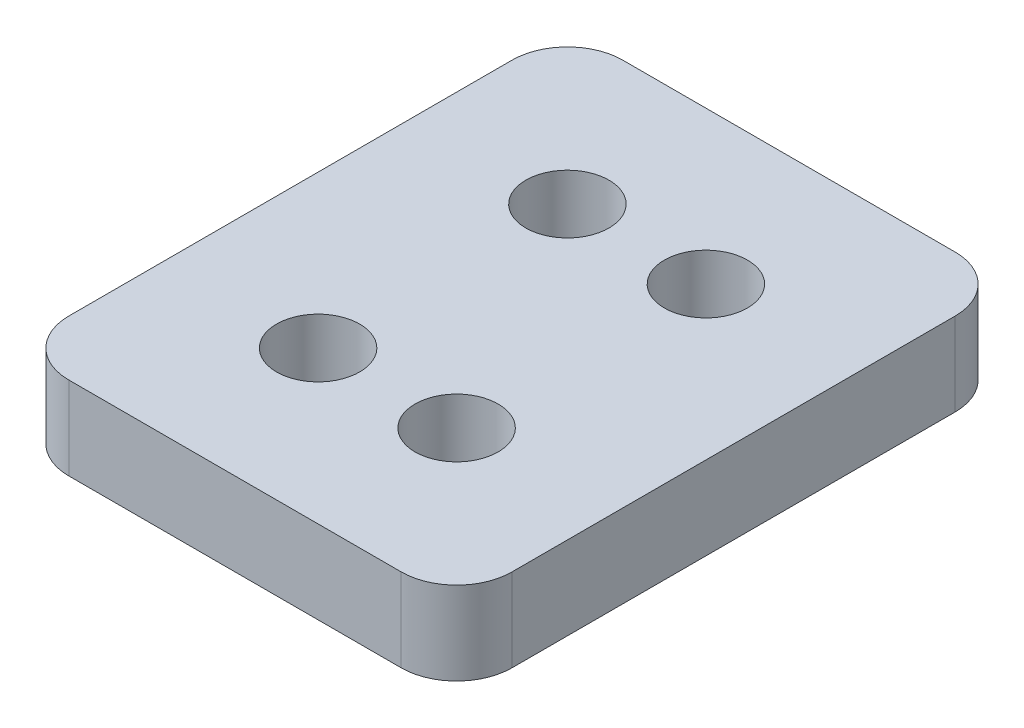
ISO-10303-21;
HEADER;
FILE_DESCRIPTION(('STEP AP214'),'2;1');
FILE_NAME('part.step','',(''),(''),'','','');
FILE_SCHEMA(('AUTOMOTIVE_DESIGN { 1 0 10303 214 1 1 1 1 }'));
ENDSEC;
DATA;
#1=APPLICATION_CONTEXT('core data for automotive mechanical design processes');
#2=APPLICATION_PROTOCOL_DEFINITION('international standard','automotive_design',2000,#1);
#3=PRODUCT_CONTEXT('',#1,'mechanical');
#4=PRODUCT('Part','Part','',(#3));
#5=PRODUCT_RELATED_PRODUCT_CATEGORY('part','',(#4));
#6=PRODUCT_DEFINITION_FORMATION('','',#4);
#7=PRODUCT_DEFINITION_CONTEXT('part definition',#1,'design');
#8=PRODUCT_DEFINITION('design','',#6,#7);
#9=PRODUCT_DEFINITION_SHAPE('','',#8);
#10=(LENGTH_UNIT() NAMED_UNIT(*) SI_UNIT(.MILLI.,.METRE.));
#11=(NAMED_UNIT(*) PLANE_ANGLE_UNIT() SI_UNIT($,.RADIAN.));
#12=(NAMED_UNIT(*) SI_UNIT($,.STERADIAN.) SOLID_ANGLE_UNIT());
#13=UNCERTAINTY_MEASURE_WITH_UNIT(LENGTH_MEASURE(1.E-05),#10,'distance_accuracy_value','');
#14=(GEOMETRIC_REPRESENTATION_CONTEXT(3) GLOBAL_UNCERTAINTY_ASSIGNED_CONTEXT((#13)) GLOBAL_UNIT_ASSIGNED_CONTEXT((#10,
#11,#12)) REPRESENTATION_CONTEXT('',''));
#15=CARTESIAN_POINT('',(0.,0.,0.));
#16=DIRECTION('',(0.,0.,1.));
#17=DIRECTION('',(1.,0.,0.));
#18=AXIS2_PLACEMENT_3D('',#15,#16,#17);
#19=CARTESIAN_POINT('',(8.,1.5,10.));
#20=DIRECTION('',(-1.,0.,0.));
#21=DIRECTION('',(0.,0.,1.));
#22=AXIS2_PLACEMENT_3D('',#19,#20,#21);
#23=PLANE('',#22);
#24=DIRECTION('',(0.,0.,-1.));
#25=VECTOR('',#24,1.);
#26=CARTESIAN_POINT('',(8.,1.5,10.));
#27=LINE('',#26,#25);
#28=CARTESIAN_POINT('',(8.,1.5,8.));
#29=VERTEX_POINT('',#28);
#30=CARTESIAN_POINT('',(8.,1.5,-8.));
#31=VERTEX_POINT('',#30);
#32=EDGE_CURVE('E132',#29,#31,#27,.T.);
#33=ORIENTED_EDGE('',*,*,#32,.F.);
#34=DIRECTION('',(0.,-1.,0.));
#35=VECTOR('',#34,1.);
#36=CARTESIAN_POINT('',(8.,1.5,8.));
#37=LINE('',#36,#35);
#38=CARTESIAN_POINT('',(8.,-1.5,8.));
#39=VERTEX_POINT('',#38);
#40=EDGE_CURVE('E11',#29,#39,#37,.T.);
#41=ORIENTED_EDGE('',*,*,#40,.T.);
#42=DIRECTION('',(0.,0.,-1.));
#43=VECTOR('',#42,1.);
#44=CARTESIAN_POINT('',(8.,-1.5,10.));
#45=LINE('',#44,#43);
#46=CARTESIAN_POINT('',(8.,-1.5,-8.));
#47=VERTEX_POINT('',#46);
#48=EDGE_CURVE('E134',#39,#47,#45,.T.);
#49=ORIENTED_EDGE('',*,*,#48,.T.);
#50=DIRECTION('',(0.,-1.,0.));
#51=VECTOR('',#50,1.);
#52=CARTESIAN_POINT('',(8.,1.5,-8.));
#53=LINE('',#52,#51);
#54=EDGE_CURVE('E45',#47,#31,#53,.F.);
#55=ORIENTED_EDGE('',*,*,#54,.T.);
#56=EDGE_LOOP('',(#33,#41,#49,#55));
#57=FACE_BOUND('',#56,.T.);
#58=ADVANCED_FACE('F37',(#57),#23,.F.);
#59=CARTESIAN_POINT('',(-8.,1.5,-10.));
#60=DIRECTION('',(0.,0.,1.));
#61=DIRECTION('',(1.,0.,0.));
#62=AXIS2_PLACEMENT_3D('',#59,#60,#61);
#63=PLANE('',#62);
#64=DIRECTION('',(-1.,0.,0.));
#65=VECTOR('',#64,1.);
#66=CARTESIAN_POINT('',(-8.,-1.5,-10.));
#67=LINE('',#66,#65);
#68=CARTESIAN_POINT('',(6.,-1.5,-10.));
#69=VERTEX_POINT('',#68);
#70=CARTESIAN_POINT('',(-6.,-1.5,-10.));
#71=VERTEX_POINT('',#70);
#72=EDGE_CURVE('E130',#69,#71,#67,.T.);
#73=ORIENTED_EDGE('',*,*,#72,.T.);
#74=DIRECTION('',(0.,-1.,0.));
#75=VECTOR('',#74,1.);
#76=CARTESIAN_POINT('',(-6.,1.5,-10.));
#77=LINE('',#76,#75);
#78=CARTESIAN_POINT('',(-6.,1.5,-10.));
#79=VERTEX_POINT('',#78);
#80=EDGE_CURVE('E109',#71,#79,#77,.F.);
#81=ORIENTED_EDGE('',*,*,#80,.T.);
#82=DIRECTION('',(-1.,0.,0.));
#83=VECTOR('',#82,1.);
#84=CARTESIAN_POINT('',(-8.,1.5,-10.));
#85=LINE('',#84,#83);
#86=CARTESIAN_POINT('',(6.,1.5,-10.));
#87=VERTEX_POINT('',#86);
#88=EDGE_CURVE('E170',#87,#79,#85,.T.);
#89=ORIENTED_EDGE('',*,*,#88,.F.);
#90=DIRECTION('',(0.,-1.,0.));
#91=VECTOR('',#90,1.);
#92=CARTESIAN_POINT('',(6.,1.5,-10.));
#93=LINE('',#92,#91);
#94=EDGE_CURVE('E114',#87,#69,#93,.T.);
#95=ORIENTED_EDGE('',*,*,#94,.T.);
#96=EDGE_LOOP('',(#73,#81,#89,#95));
#97=FACE_BOUND('',#96,.T.);
#98=ADVANCED_FACE('F174',(#97),#63,.F.);
#99=CARTESIAN_POINT('',(-8.,1.5,10.));
#100=DIRECTION('',(1.,0.,0.));
#101=DIRECTION('',(0.,0.,-1.));
#102=AXIS2_PLACEMENT_3D('',#99,#100,#101);
#103=PLANE('',#102);
#104=DIRECTION('',(0.,0.,1.));
#105=VECTOR('',#104,1.);
#106=CARTESIAN_POINT('',(-8.,1.5,10.));
#107=LINE('',#106,#105);
#108=CARTESIAN_POINT('',(-8.,1.5,-8.));
#109=VERTEX_POINT('',#108);
#110=CARTESIAN_POINT('',(-8.,1.5,8.));
#111=VERTEX_POINT('',#110);
#112=EDGE_CURVE('E123',#109,#111,#107,.T.);
#113=ORIENTED_EDGE('',*,*,#112,.F.);
#114=DIRECTION('',(0.,-1.,0.));
#115=VECTOR('',#114,1.);
#116=CARTESIAN_POINT('',(-8.,1.5,-8.));
#117=LINE('',#116,#115);
#118=CARTESIAN_POINT('',(-8.,-1.5,-8.));
#119=VERTEX_POINT('',#118);
#120=EDGE_CURVE('E108',#109,#119,#117,.T.);
#121=ORIENTED_EDGE('',*,*,#120,.T.);
#122=DIRECTION('',(0.,0.,1.));
#123=VECTOR('',#122,1.);
#124=CARTESIAN_POINT('',(-8.,-1.5,10.));
#125=LINE('',#124,#123);
#126=CARTESIAN_POINT('',(-8.,-1.5,8.));
#127=VERTEX_POINT('',#126);
#128=EDGE_CURVE('E121',#119,#127,#125,.T.);
#129=ORIENTED_EDGE('',*,*,#128,.T.);
#130=DIRECTION('',(0.,-1.,0.));
#131=VECTOR('',#130,1.);
#132=CARTESIAN_POINT('',(-8.,1.5,8.));
#133=LINE('',#132,#131);
#134=EDGE_CURVE('E125',#127,#111,#133,.F.);
#135=ORIENTED_EDGE('',*,*,#134,.T.);
#136=EDGE_LOOP('',(#113,#121,#129,#135));
#137=FACE_BOUND('',#136,.T.);
#138=ADVANCED_FACE('F120',(#137),#103,.F.);
#139=CARTESIAN_POINT('',(-8.,1.5,10.));
#140=DIRECTION('',(0.,0.,-1.));
#141=DIRECTION('',(-1.,0.,0.));
#142=AXIS2_PLACEMENT_3D('',#139,#140,#141);
#143=PLANE('',#142);
#144=DIRECTION('',(1.,0.,0.));
#145=VECTOR('',#144,1.);
#146=CARTESIAN_POINT('',(-8.,1.5,10.));
#147=LINE('',#146,#145);
#148=CARTESIAN_POINT('',(-6.,1.5,10.));
#149=VERTEX_POINT('',#148);
#150=CARTESIAN_POINT('',(6.,1.5,10.));
#151=VERTEX_POINT('',#150);
#152=EDGE_CURVE('E138',#149,#151,#147,.T.);
#153=ORIENTED_EDGE('',*,*,#152,.F.);
#154=DIRECTION('',(0.,-1.,0.));
#155=VECTOR('',#154,1.);
#156=CARTESIAN_POINT('',(-6.,1.5,10.));
#157=LINE('',#156,#155);
#158=CARTESIAN_POINT('',(-6.,-1.5,10.));
#159=VERTEX_POINT('',#158);
#160=EDGE_CURVE('E155',#149,#159,#157,.T.);
#161=ORIENTED_EDGE('',*,*,#160,.T.);
#162=DIRECTION('',(1.,0.,0.));
#163=VECTOR('',#162,1.);
#164=CARTESIAN_POINT('',(-8.,-1.5,10.));
#165=LINE('',#164,#163);
#166=CARTESIAN_POINT('',(6.,-1.5,10.));
#167=VERTEX_POINT('',#166);
#168=EDGE_CURVE('E129',#159,#167,#165,.T.);
#169=ORIENTED_EDGE('',*,*,#168,.T.);
#170=DIRECTION('',(0.,-1.,0.));
#171=VECTOR('',#170,1.);
#172=CARTESIAN_POINT('',(6.,1.5,10.));
#173=LINE('',#172,#171);
#174=EDGE_CURVE('E52',#167,#151,#173,.F.);
#175=ORIENTED_EDGE('',*,*,#174,.T.);
#176=EDGE_LOOP('',(#153,#161,#169,#175));
#177=FACE_BOUND('',#176,.T.);
#178=ADVANCED_FACE('F208',(#177),#143,.F.);
#179=CARTESIAN_POINT('',(0.,1.5,0.));
#180=DIRECTION('',(0.,-1.,0.));
#181=DIRECTION('',(0.,0.,-1.));
#182=AXIS2_PLACEMENT_3D('',#179,#180,#181);
#183=PLANE('',#182);
#184=CARTESIAN_POINT('',(2.5,1.5,4.5));
#185=DIRECTION('',(0.,1.,0.));
#186=DIRECTION('',(0.,0.,1.));
#187=AXIS2_PLACEMENT_3D('',#184,#185,#186);
#188=CIRCLE('',#187,1.5);
#189=CARTESIAN_POINT('',(2.5,1.5,6.));
#190=VERTEX_POINT('',#189);
#191=EDGE_CURVE('E189',#190,#190,#188,.T.);
#192=ORIENTED_EDGE('',*,*,#191,.F.);
#193=EDGE_LOOP('',(#192));
#194=FACE_BOUND('',#193,.T.);
#195=CARTESIAN_POINT('',(2.5,1.5,-4.5));
#196=DIRECTION('',(0.,1.,0.));
#197=DIRECTION('',(0.,0.,1.));
#198=AXIS2_PLACEMENT_3D('',#195,#196,#197);
#199=CIRCLE('',#198,1.5);
#200=CARTESIAN_POINT('',(2.5,1.5,-3.));
#201=VERTEX_POINT('',#200);
#202=EDGE_CURVE('E195',#201,#201,#199,.T.);
#203=ORIENTED_EDGE('',*,*,#202,.F.);
#204=EDGE_LOOP('',(#203));
#205=FACE_BOUND('',#204,.T.);
#206=CARTESIAN_POINT('',(-2.5,1.5,-4.5));
#207=DIRECTION('',(0.,1.,0.));
#208=DIRECTION('',(0.,0.,1.));
#209=AXIS2_PLACEMENT_3D('',#206,#207,#208);
#210=CIRCLE('',#209,1.5);
#211=CARTESIAN_POINT('',(-2.5,1.5,-3.));
#212=VERTEX_POINT('',#211);
#213=EDGE_CURVE('E184',#212,#212,#210,.T.);
#214=ORIENTED_EDGE('',*,*,#213,.F.);
#215=EDGE_LOOP('',(#214));
#216=FACE_BOUND('',#215,.T.);
#217=CARTESIAN_POINT('',(-2.5,1.5,4.5));
#218=DIRECTION('',(0.,1.,0.));
#219=DIRECTION('',(0.,0.,1.));
#220=AXIS2_PLACEMENT_3D('',#217,#218,#219);
#221=CIRCLE('',#220,1.5);
#222=CARTESIAN_POINT('',(-2.5,1.5,6.));
#223=VERTEX_POINT('',#222);
#224=EDGE_CURVE('E177',#223,#223,#221,.T.);
#225=ORIENTED_EDGE('',*,*,#224,.F.);
#226=EDGE_LOOP('',(#225));
#227=FACE_BOUND('',#226,.T.);
#228=ORIENTED_EDGE('',*,*,#88,.T.);
#229=CARTESIAN_POINT('',(-6.,1.5,-8.));
#230=DIRECTION('',(0.,-1.,0.));
#231=DIRECTION('',(0.,0.,-1.));
#232=AXIS2_PLACEMENT_3D('',#229,#230,#231);
#233=CIRCLE('',#232,2.);
#234=EDGE_CURVE('E152',#79,#109,#233,.F.);
#235=ORIENTED_EDGE('',*,*,#234,.T.);
#236=ORIENTED_EDGE('',*,*,#112,.T.);
#237=CARTESIAN_POINT('',(-6.,1.5,8.));
#238=DIRECTION('',(0.,-1.,0.));
#239=DIRECTION('',(0.,0.,-1.));
#240=AXIS2_PLACEMENT_3D('',#237,#238,#239);
#241=CIRCLE('',#240,2.);
#242=EDGE_CURVE('E59',#111,#149,#241,.F.);
#243=ORIENTED_EDGE('',*,*,#242,.T.);
#244=ORIENTED_EDGE('',*,*,#152,.T.);
#245=CARTESIAN_POINT('',(6.,1.5,8.));
#246=DIRECTION('',(0.,-1.,0.));
#247=DIRECTION('',(0.,0.,-1.));
#248=AXIS2_PLACEMENT_3D('',#245,#246,#247);
#249=CIRCLE('',#248,2.);
#250=EDGE_CURVE('E149',#151,#29,#249,.F.);
#251=ORIENTED_EDGE('',*,*,#250,.T.);
#252=ORIENTED_EDGE('',*,*,#32,.T.);
#253=CARTESIAN_POINT('',(6.,1.5,-8.));
#254=DIRECTION('',(0.,-1.,0.));
#255=DIRECTION('',(0.,0.,-1.));
#256=AXIS2_PLACEMENT_3D('',#253,#254,#255);
#257=CIRCLE('',#256,2.);
#258=EDGE_CURVE('E147',#31,#87,#257,.F.);
#259=ORIENTED_EDGE('',*,*,#258,.T.);
#260=EDGE_LOOP('',(#228,#235,#236,#243,#244,#251,#252,#259));
#261=FACE_BOUND('',#260,.T.);
#262=ADVANCED_FACE('F167',(#194,#205,#216,#227,#261),#183,.F.);
#263=CARTESIAN_POINT('',(0.,-1.5,0.));
#264=DIRECTION('',(0.,-1.,0.));
#265=DIRECTION('',(0.,0.,-1.));
#266=AXIS2_PLACEMENT_3D('',#263,#264,#265);
#267=PLANE('',#266);
#268=CARTESIAN_POINT('',(2.5,-1.5,4.5));
#269=DIRECTION('',(0.,1.,0.));
#270=DIRECTION('',(0.,0.,1.));
#271=AXIS2_PLACEMENT_3D('',#268,#269,#270);
#272=CIRCLE('',#271,1.5);
#273=CARTESIAN_POINT('',(2.5,-1.5,6.));
#274=VERTEX_POINT('',#273);
#275=EDGE_CURVE('E186',#274,#274,#272,.T.);
#276=ORIENTED_EDGE('',*,*,#275,.T.);
#277=EDGE_LOOP('',(#276));
#278=FACE_BOUND('',#277,.T.);
#279=CARTESIAN_POINT('',(2.5,-1.5,-4.5));
#280=DIRECTION('',(0.,1.,0.));
#281=DIRECTION('',(0.,0.,1.));
#282=AXIS2_PLACEMENT_3D('',#279,#280,#281);
#283=CIRCLE('',#282,1.5);
#284=CARTESIAN_POINT('',(2.5,-1.5,-3.));
#285=VERTEX_POINT('',#284);
#286=EDGE_CURVE('E192',#285,#285,#283,.T.);
#287=ORIENTED_EDGE('',*,*,#286,.T.);
#288=EDGE_LOOP('',(#287));
#289=FACE_BOUND('',#288,.T.);
#290=CARTESIAN_POINT('',(-2.5,-1.5,-4.5));
#291=DIRECTION('',(0.,1.,0.));
#292=DIRECTION('',(0.,0.,1.));
#293=AXIS2_PLACEMENT_3D('',#290,#291,#292);
#294=CIRCLE('',#293,1.5);
#295=CARTESIAN_POINT('',(-2.5,-1.5,-3.));
#296=VERTEX_POINT('',#295);
#297=EDGE_CURVE('E198',#296,#296,#294,.T.);
#298=ORIENTED_EDGE('',*,*,#297,.T.);
#299=EDGE_LOOP('',(#298));
#300=FACE_BOUND('',#299,.T.);
#301=CARTESIAN_POINT('',(-2.5,-1.5,4.5));
#302=DIRECTION('',(0.,1.,0.));
#303=DIRECTION('',(0.,0.,1.));
#304=AXIS2_PLACEMENT_3D('',#301,#302,#303);
#305=CIRCLE('',#304,1.5);
#306=CARTESIAN_POINT('',(-2.5,-1.5,6.));
#307=VERTEX_POINT('',#306);
#308=EDGE_CURVE('E175',#307,#307,#305,.T.);
#309=ORIENTED_EDGE('',*,*,#308,.T.);
#310=EDGE_LOOP('',(#309));
#311=FACE_BOUND('',#310,.T.);
#312=ORIENTED_EDGE('',*,*,#128,.F.);
#313=CARTESIAN_POINT('',(-6.,-1.5,-8.));
#314=DIRECTION('',(0.,-1.,0.));
#315=DIRECTION('',(0.,0.,-1.));
#316=AXIS2_PLACEMENT_3D('',#313,#314,#315);
#317=CIRCLE('',#316,2.);
#318=EDGE_CURVE('E104',#119,#71,#317,.T.);
#319=ORIENTED_EDGE('',*,*,#318,.T.);
#320=ORIENTED_EDGE('',*,*,#72,.F.);
#321=CARTESIAN_POINT('',(6.,-1.5,-8.));
#322=DIRECTION('',(0.,-1.,0.));
#323=DIRECTION('',(0.,0.,-1.));
#324=AXIS2_PLACEMENT_3D('',#321,#322,#323);
#325=CIRCLE('',#324,2.);
#326=EDGE_CURVE('E124',#69,#47,#325,.T.);
#327=ORIENTED_EDGE('',*,*,#326,.T.);
#328=ORIENTED_EDGE('',*,*,#48,.F.);
#329=CARTESIAN_POINT('',(6.,-1.5,8.));
#330=DIRECTION('',(0.,-1.,0.));
#331=DIRECTION('',(0.,0.,-1.));
#332=AXIS2_PLACEMENT_3D('',#329,#330,#331);
#333=CIRCLE('',#332,2.);
#334=EDGE_CURVE('E141',#39,#167,#333,.T.);
#335=ORIENTED_EDGE('',*,*,#334,.T.);
#336=ORIENTED_EDGE('',*,*,#168,.F.);
#337=CARTESIAN_POINT('',(-6.,-1.5,8.));
#338=DIRECTION('',(0.,-1.,0.));
#339=DIRECTION('',(0.,0.,-1.));
#340=AXIS2_PLACEMENT_3D('',#337,#338,#339);
#341=CIRCLE('',#340,2.);
#342=EDGE_CURVE('E115',#159,#127,#341,.T.);
#343=ORIENTED_EDGE('',*,*,#342,.T.);
#344=EDGE_LOOP('',(#312,#319,#320,#327,#328,#335,#336,#343));
#345=FACE_BOUND('',#344,.T.);
#346=ADVANCED_FACE('F127',(#278,#289,#300,#311,#345),#267,.T.);
#347=CARTESIAN_POINT('',(-2.5,-1.5,4.5));
#348=DIRECTION('',(0.,1.,0.));
#349=DIRECTION('',(0.,0.,1.));
#350=AXIS2_PLACEMENT_3D('',#347,#348,#349);
#351=CYLINDRICAL_SURFACE('',#350,1.5);
#352=ORIENTED_EDGE('',*,*,#308,.F.);
#353=EDGE_LOOP('',(#352));
#354=FACE_BOUND('',#353,.T.);
#355=ORIENTED_EDGE('',*,*,#224,.T.);
#356=EDGE_LOOP('',(#355));
#357=FACE_BOUND('',#356,.T.);
#358=ADVANCED_FACE('F213',(#354,#357),#351,.F.);
#359=CARTESIAN_POINT('',(-2.5,-1.5,-4.5));
#360=DIRECTION('',(0.,1.,0.));
#361=DIRECTION('',(0.,0.,1.));
#362=AXIS2_PLACEMENT_3D('',#359,#360,#361);
#363=CYLINDRICAL_SURFACE('',#362,1.5);
#364=ORIENTED_EDGE('',*,*,#297,.F.);
#365=EDGE_LOOP('',(#364));
#366=FACE_BOUND('',#365,.T.);
#367=ORIENTED_EDGE('',*,*,#213,.T.);
#368=EDGE_LOOP('',(#367));
#369=FACE_BOUND('',#368,.T.);
#370=ADVANCED_FACE('F204',(#366,#369),#363,.F.);
#371=CARTESIAN_POINT('',(2.5,-1.5,-4.5));
#372=DIRECTION('',(0.,1.,0.));
#373=DIRECTION('',(0.,0.,1.));
#374=AXIS2_PLACEMENT_3D('',#371,#372,#373);
#375=CYLINDRICAL_SURFACE('',#374,1.5);
#376=ORIENTED_EDGE('',*,*,#286,.F.);
#377=EDGE_LOOP('',(#376));
#378=FACE_BOUND('',#377,.T.);
#379=ORIENTED_EDGE('',*,*,#202,.T.);
#380=EDGE_LOOP('',(#379));
#381=FACE_BOUND('',#380,.T.);
#382=ADVANCED_FACE('F221',(#378,#381),#375,.F.);
#383=CARTESIAN_POINT('',(2.5,-1.5,4.5));
#384=DIRECTION('',(0.,1.,0.));
#385=DIRECTION('',(0.,0.,1.));
#386=AXIS2_PLACEMENT_3D('',#383,#384,#385);
#387=CYLINDRICAL_SURFACE('',#386,1.5);
#388=ORIENTED_EDGE('',*,*,#275,.F.);
#389=EDGE_LOOP('',(#388));
#390=FACE_BOUND('',#389,.T.);
#391=ORIENTED_EDGE('',*,*,#191,.T.);
#392=EDGE_LOOP('',(#391));
#393=FACE_BOUND('',#392,.T.);
#394=ADVANCED_FACE('F241',(#390,#393),#387,.F.);
#395=CARTESIAN_POINT('',(-6.,1.5,-8.));
#396=DIRECTION('',(0.,-1.,0.));
#397=DIRECTION('',(0.,0.,-1.));
#398=AXIS2_PLACEMENT_3D('',#395,#396,#397);
#399=CYLINDRICAL_SURFACE('',#398,2.);
#400=ORIENTED_EDGE('',*,*,#234,.F.);
#401=ORIENTED_EDGE('',*,*,#80,.F.);
#402=ORIENTED_EDGE('',*,*,#318,.F.);
#403=ORIENTED_EDGE('',*,*,#120,.F.);
#404=EDGE_LOOP('',(#400,#401,#402,#403));
#405=FACE_BOUND('',#404,.T.);
#406=ADVANCED_FACE('F107',(#405),#399,.T.);
#407=CARTESIAN_POINT('',(-6.,1.5,8.));
#408=DIRECTION('',(0.,-1.,0.));
#409=DIRECTION('',(0.,0.,-1.));
#410=AXIS2_PLACEMENT_3D('',#407,#408,#409);
#411=CYLINDRICAL_SURFACE('',#410,2.);
#412=ORIENTED_EDGE('',*,*,#242,.F.);
#413=ORIENTED_EDGE('',*,*,#134,.F.);
#414=ORIENTED_EDGE('',*,*,#342,.F.);
#415=ORIENTED_EDGE('',*,*,#160,.F.);
#416=EDGE_LOOP('',(#412,#413,#414,#415));
#417=FACE_BOUND('',#416,.T.);
#418=ADVANCED_FACE('F240',(#417),#411,.T.);
#419=CARTESIAN_POINT('',(6.,1.5,8.));
#420=DIRECTION('',(0.,-1.,0.));
#421=DIRECTION('',(0.,0.,-1.));
#422=AXIS2_PLACEMENT_3D('',#419,#420,#421);
#423=CYLINDRICAL_SURFACE('',#422,2.);
#424=ORIENTED_EDGE('',*,*,#250,.F.);
#425=ORIENTED_EDGE('',*,*,#174,.F.);
#426=ORIENTED_EDGE('',*,*,#334,.F.);
#427=ORIENTED_EDGE('',*,*,#40,.F.);
#428=EDGE_LOOP('',(#424,#425,#426,#427));
#429=FACE_BOUND('',#428,.T.);
#430=ADVANCED_FACE('F243',(#429),#423,.T.);
#431=CARTESIAN_POINT('',(6.,1.5,-8.));
#432=DIRECTION('',(0.,-1.,0.));
#433=DIRECTION('',(0.,0.,-1.));
#434=AXIS2_PLACEMENT_3D('',#431,#432,#433);
#435=CYLINDRICAL_SURFACE('',#434,2.);
#436=ORIENTED_EDGE('',*,*,#258,.F.);
#437=ORIENTED_EDGE('',*,*,#54,.F.);
#438=ORIENTED_EDGE('',*,*,#326,.F.);
#439=ORIENTED_EDGE('',*,*,#94,.F.);
#440=EDGE_LOOP('',(#436,#437,#438,#439));
#441=FACE_BOUND('',#440,.T.);
#442=ADVANCED_FACE('F39',(#441),#435,.T.);
#443=CLOSED_SHELL('',(#58,#98,#138,#178,#262,#346,#358,#370,#382,#394,#406,#418,#430,#442));
#444=MANIFOLD_SOLID_BREP('B2',#443);
#445=ADVANCED_BREP_SHAPE_REPRESENTATION('',(#18,#444),#14);
#446=SHAPE_DEFINITION_REPRESENTATION(#9,#445);
ENDSEC;
END-ISO-10303-21;
